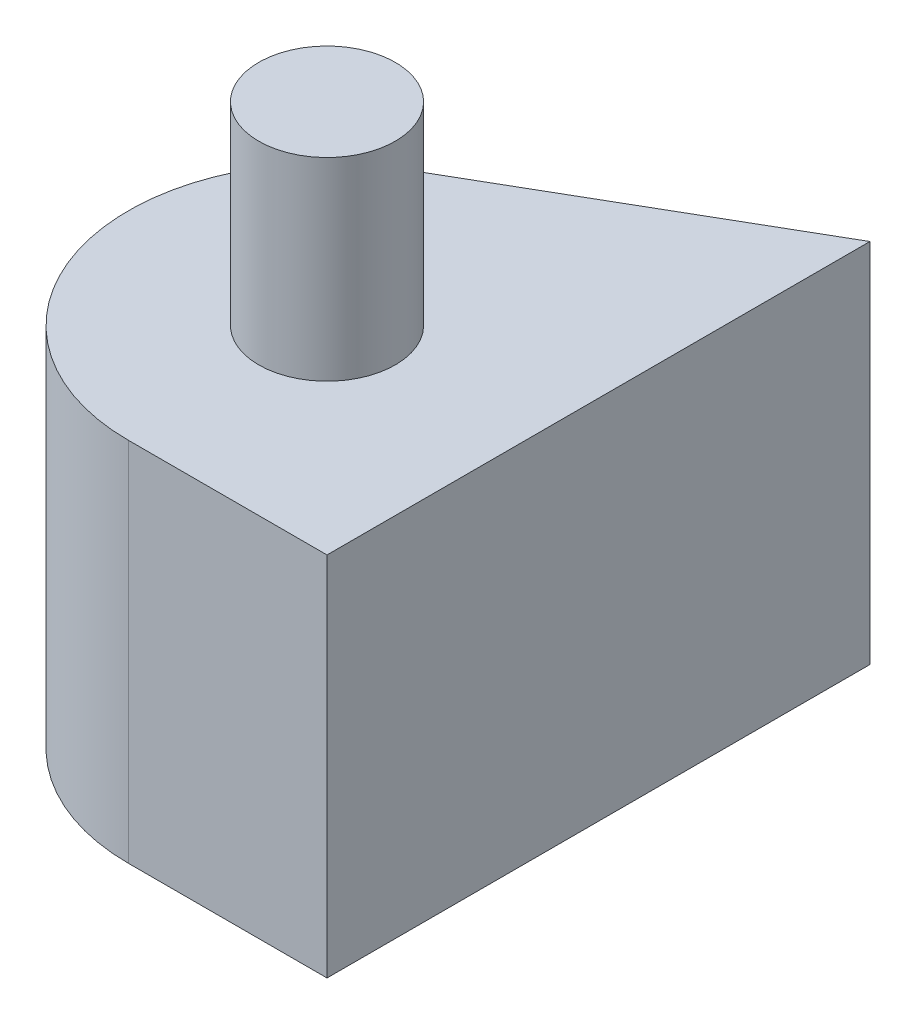
ISO-10303-21;
HEADER;
FILE_DESCRIPTION(('STEP AP214'),'2;1');
FILE_NAME('part.step','',(''),(''),'','','');
FILE_SCHEMA(('AUTOMOTIVE_DESIGN { 1 0 10303 214 1 1 1 1 }'));
ENDSEC;
DATA;
#1=APPLICATION_CONTEXT('core data for automotive mechanical design processes');
#2=APPLICATION_PROTOCOL_DEFINITION('international standard','automotive_design',2000,#1);
#3=PRODUCT_CONTEXT('',#1,'mechanical');
#4=PRODUCT('Part','Part','',(#3));
#5=PRODUCT_RELATED_PRODUCT_CATEGORY('part','',(#4));
#6=PRODUCT_DEFINITION_FORMATION('','',#4);
#7=PRODUCT_DEFINITION_CONTEXT('part definition',#1,'design');
#8=PRODUCT_DEFINITION('design','',#6,#7);
#9=PRODUCT_DEFINITION_SHAPE('','',#8);
#10=(LENGTH_UNIT() NAMED_UNIT(*) SI_UNIT(.MILLI.,.METRE.));
#11=(NAMED_UNIT(*) PLANE_ANGLE_UNIT() SI_UNIT($,.RADIAN.));
#12=(NAMED_UNIT(*) SI_UNIT($,.STERADIAN.) SOLID_ANGLE_UNIT());
#13=UNCERTAINTY_MEASURE_WITH_UNIT(LENGTH_MEASURE(1.E-05),#10,'distance_accuracy_value','');
#14=(GEOMETRIC_REPRESENTATION_CONTEXT(3) GLOBAL_UNCERTAINTY_ASSIGNED_CONTEXT((#13)) GLOBAL_UNIT_ASSIGNED_CONTEXT((#10,
#11,#12)) REPRESENTATION_CONTEXT('',''));
#15=CARTESIAN_POINT('',(0.,0.,0.));
#16=DIRECTION('',(0.,0.,1.));
#17=DIRECTION('',(1.,0.,0.));
#18=AXIS2_PLACEMENT_3D('',#15,#16,#17);
#19=CARTESIAN_POINT('',(0.,14.75,0.));
#20=DIRECTION('',(0.,-1.,0.));
#21=DIRECTION('',(0.,0.,-1.));
#22=AXIS2_PLACEMENT_3D('',#19,#20,#21);
#23=CYLINDRICAL_SURFACE('',#22,8.);
#24=CARTESIAN_POINT('',(0.,0.,0.));
#25=DIRECTION('',(0.,1.,0.));
#26=DIRECTION('',(0.,0.,1.));
#27=AXIS2_PLACEMENT_3D('',#24,#25,#26);
#28=CIRCLE('',#27,8.);
#29=CARTESIAN_POINT('',(-4.00000000000003,0.,-6.92820323027549));
#30=VERTEX_POINT('',#29);
#31=CARTESIAN_POINT('',(0.,0.,8.));
#32=VERTEX_POINT('',#31);
#33=EDGE_CURVE('E118',#30,#32,#28,.T.);
#34=ORIENTED_EDGE('',*,*,#33,.T.);
#35=DIRECTION('',(0.,-1.,0.));
#36=VECTOR('',#35,1.);
#37=CARTESIAN_POINT('',(0.,14.75,8.));
#38=LINE('',#37,#36);
#39=CARTESIAN_POINT('',(0.,14.75,8.));
#40=VERTEX_POINT('',#39);
#41=EDGE_CURVE('E55',#40,#32,#38,.T.);
#42=ORIENTED_EDGE('',*,*,#41,.F.);
#43=CARTESIAN_POINT('',(0.,14.75,0.));
#44=DIRECTION('',(0.,1.,0.));
#45=DIRECTION('',(0.,0.,1.));
#46=AXIS2_PLACEMENT_3D('',#43,#44,#45);
#47=CIRCLE('',#46,8.);
#48=CARTESIAN_POINT('',(-4.00000000000003,14.75,-6.92820323027549));
#49=VERTEX_POINT('',#48);
#50=EDGE_CURVE('E100',#49,#40,#47,.T.);
#51=ORIENTED_EDGE('',*,*,#50,.F.);
#52=DIRECTION('',(0.,-1.,0.));
#53=VECTOR('',#52,1.);
#54=CARTESIAN_POINT('',(-4.00000000000003,14.75,-6.92820323027549));
#55=LINE('',#54,#53);
#56=EDGE_CURVE('E114',#49,#30,#55,.T.);
#57=ORIENTED_EDGE('',*,*,#56,.T.);
#58=EDGE_LOOP('',(#34,#42,#51,#57));
#59=FACE_BOUND('',#58,.T.);
#60=ADVANCED_FACE('F45',(#59),#23,.T.);
#61=CARTESIAN_POINT('',(0.,14.75,8.));
#62=DIRECTION('',(0.,0.,-1.));
#63=DIRECTION('',(-1.,0.,0.));
#64=AXIS2_PLACEMENT_3D('',#61,#62,#63);
#65=PLANE('',#64);
#66=DIRECTION('',(1.,0.,0.));
#67=VECTOR('',#66,1.);
#68=CARTESIAN_POINT('',(0.,0.,8.));
#69=LINE('',#68,#67);
#70=CARTESIAN_POINT('',(8.,0.,8.));
#71=VERTEX_POINT('',#70);
#72=EDGE_CURVE('E106',#32,#71,#69,.T.);
#73=ORIENTED_EDGE('',*,*,#72,.T.);
#74=DIRECTION('',(0.,-1.,0.));
#75=VECTOR('',#74,1.);
#76=CARTESIAN_POINT('',(8.,14.75,8.));
#77=LINE('',#76,#75);
#78=CARTESIAN_POINT('',(8.,14.75,8.));
#79=VERTEX_POINT('',#78);
#80=EDGE_CURVE('E104',#79,#71,#77,.T.);
#81=ORIENTED_EDGE('',*,*,#80,.F.);
#82=DIRECTION('',(1.,0.,0.));
#83=VECTOR('',#82,1.);
#84=CARTESIAN_POINT('',(0.,14.75,8.));
#85=LINE('',#84,#83);
#86=EDGE_CURVE('E95',#40,#79,#85,.T.);
#87=ORIENTED_EDGE('',*,*,#86,.F.);
#88=ORIENTED_EDGE('',*,*,#41,.T.);
#89=EDGE_LOOP('',(#73,#81,#87,#88));
#90=FACE_BOUND('',#89,.T.);
#91=ADVANCED_FACE('F105',(#90),#65,.F.);
#92=CARTESIAN_POINT('',(8.,14.75,8.));
#93=DIRECTION('',(-1.,0.,0.));
#94=DIRECTION('',(0.,0.,1.));
#95=AXIS2_PLACEMENT_3D('',#92,#93,#94);
#96=PLANE('',#95);
#97=DIRECTION('',(0.,0.,-1.));
#98=VECTOR('',#97,1.);
#99=CARTESIAN_POINT('',(8.,0.,8.));
#100=LINE('',#99,#98);
#101=CARTESIAN_POINT('',(8.,0.,-13.8564064605511));
#102=VERTEX_POINT('',#101);
#103=EDGE_CURVE('E81',#71,#102,#100,.T.);
#104=ORIENTED_EDGE('',*,*,#103,.T.);
#105=DIRECTION('',(0.,-1.,0.));
#106=VECTOR('',#105,1.);
#107=CARTESIAN_POINT('',(8.,14.75,-13.8564064605511));
#108=LINE('',#107,#106);
#109=CARTESIAN_POINT('',(8.,14.75,-13.8564064605511));
#110=VERTEX_POINT('',#109);
#111=EDGE_CURVE('E108',#110,#102,#108,.T.);
#112=ORIENTED_EDGE('',*,*,#111,.F.);
#113=DIRECTION('',(0.,0.,-1.));
#114=VECTOR('',#113,1.);
#115=CARTESIAN_POINT('',(8.,14.75,8.));
#116=LINE('',#115,#114);
#117=EDGE_CURVE('E98',#79,#110,#116,.T.);
#118=ORIENTED_EDGE('',*,*,#117,.F.);
#119=ORIENTED_EDGE('',*,*,#80,.T.);
#120=EDGE_LOOP('',(#104,#112,#118,#119));
#121=FACE_BOUND('',#120,.T.);
#122=ADVANCED_FACE('F110',(#121),#96,.F.);
#123=CARTESIAN_POINT('',(8.,14.75,-13.8564064605511));
#124=DIRECTION('',(0.500000000000004,0.,0.866025403784436));
#125=DIRECTION('',(0.866025403784436,0.,-0.500000000000004));
#126=AXIS2_PLACEMENT_3D('',#123,#124,#125);
#127=PLANE('',#126);
#128=DIRECTION('',(-0.866025403784436,0.,0.500000000000004));
#129=VECTOR('',#128,1.);
#130=CARTESIAN_POINT('',(8.,0.,-13.8564064605511));
#131=LINE('',#130,#129);
#132=EDGE_CURVE('E87',#102,#30,#131,.T.);
#133=ORIENTED_EDGE('',*,*,#132,.T.);
#134=ORIENTED_EDGE('',*,*,#56,.F.);
#135=DIRECTION('',(-0.866025403784436,0.,0.500000000000004));
#136=VECTOR('',#135,1.);
#137=CARTESIAN_POINT('',(8.,14.75,-13.8564064605511));
#138=LINE('',#137,#136);
#139=EDGE_CURVE('E64',#110,#49,#138,.T.);
#140=ORIENTED_EDGE('',*,*,#139,.F.);
#141=ORIENTED_EDGE('',*,*,#111,.T.);
#142=EDGE_LOOP('',(#133,#134,#140,#141));
#143=FACE_BOUND('',#142,.T.);
#144=ADVANCED_FACE('F148',(#143),#127,.F.);
#145=CARTESIAN_POINT('',(0.,14.75,0.));
#146=DIRECTION('',(0.,1.,0.));
#147=DIRECTION('',(0.,0.,1.));
#148=AXIS2_PLACEMENT_3D('',#145,#146,#147);
#149=PLANE('',#148);
#150=CARTESIAN_POINT('',(0.,14.75,0.));
#151=DIRECTION('',(0.,1.,0.));
#152=DIRECTION('',(0.,0.,1.));
#153=AXIS2_PLACEMENT_3D('',#150,#151,#152);
#154=CIRCLE('',#153,2.75);
#155=CARTESIAN_POINT('',(0.,14.75,2.75));
#156=VERTEX_POINT('',#155);
#157=EDGE_CURVE('E11',#156,#156,#154,.T.);
#158=ORIENTED_EDGE('',*,*,#157,.F.);
#159=EDGE_LOOP('',(#158));
#160=FACE_BOUND('',#159,.T.);
#161=ORIENTED_EDGE('',*,*,#50,.T.);
#162=ORIENTED_EDGE('',*,*,#86,.T.);
#163=ORIENTED_EDGE('',*,*,#117,.T.);
#164=ORIENTED_EDGE('',*,*,#139,.T.);
#165=EDGE_LOOP('',(#161,#162,#163,#164));
#166=FACE_BOUND('',#165,.T.);
#167=ADVANCED_FACE('F96',(#160,#166),#149,.T.);
#168=CARTESIAN_POINT('',(0.,0.,0.));
#169=DIRECTION('',(0.,1.,0.));
#170=DIRECTION('',(0.,0.,1.));
#171=AXIS2_PLACEMENT_3D('',#168,#169,#170);
#172=PLANE('',#171);
#173=CARTESIAN_POINT('',(0.,0.,0.));
#174=DIRECTION('',(0.,1.,0.));
#175=DIRECTION('',(0.,0.,1.));
#176=AXIS2_PLACEMENT_3D('',#173,#174,#175);
#177=CIRCLE('',#176,2.75);
#178=CARTESIAN_POINT('',(0.,0.,2.75));
#179=VERTEX_POINT('',#178);
#180=EDGE_CURVE('E48',#179,#179,#177,.T.);
#181=ORIENTED_EDGE('',*,*,#180,.T.);
#182=EDGE_LOOP('',(#181));
#183=FACE_BOUND('',#182,.T.);
#184=ORIENTED_EDGE('',*,*,#33,.F.);
#185=ORIENTED_EDGE('',*,*,#132,.F.);
#186=ORIENTED_EDGE('',*,*,#103,.F.);
#187=ORIENTED_EDGE('',*,*,#72,.F.);
#188=EDGE_LOOP('',(#184,#185,#186,#187));
#189=FACE_BOUND('',#188,.T.);
#190=ADVANCED_FACE('F136',(#183,#189),#172,.F.);
#191=CARTESIAN_POINT('',(0.,22.55,0.));
#192=DIRECTION('',(0.,-1.,0.));
#193=DIRECTION('',(0.,0.,-1.));
#194=AXIS2_PLACEMENT_3D('',#191,#192,#193);
#195=CYLINDRICAL_SURFACE('',#194,2.75);
#196=CARTESIAN_POINT('',(0.,22.55,0.));
#197=DIRECTION('',(0.,1.,0.));
#198=DIRECTION('',(0.,0.,1.));
#199=AXIS2_PLACEMENT_3D('',#196,#197,#198);
#200=CIRCLE('',#199,2.75);
#201=CARTESIAN_POINT('',(0.,22.55,2.75));
#202=VERTEX_POINT('',#201);
#203=EDGE_CURVE('E122',#202,#202,#200,.T.);
#204=ORIENTED_EDGE('',*,*,#203,.F.);
#205=EDGE_LOOP('',(#204));
#206=FACE_BOUND('',#205,.T.);
#207=ORIENTED_EDGE('',*,*,#157,.T.);
#208=EDGE_LOOP('',(#207));
#209=FACE_BOUND('',#208,.T.);
#210=ADVANCED_FACE('F138',(#206,#209),#195,.T.);
#211=CARTESIAN_POINT('',(0.,22.55,0.));
#212=DIRECTION('',(0.,1.,0.));
#213=DIRECTION('',(0.,0.,1.));
#214=AXIS2_PLACEMENT_3D('',#211,#212,#213);
#215=PLANE('',#214);
#216=ORIENTED_EDGE('',*,*,#203,.T.);
#217=EDGE_LOOP('',(#216));
#218=FACE_BOUND('',#217,.T.);
#219=ADVANCED_FACE('F145',(#218),#215,.T.);
#220=CARTESIAN_POINT('',(0.,-3.15,0.));
#221=DIRECTION('',(0.,1.,0.));
#222=DIRECTION('',(0.,0.,1.));
#223=AXIS2_PLACEMENT_3D('',#220,#221,#222);
#224=CYLINDRICAL_SURFACE('',#223,2.75);
#225=CARTESIAN_POINT('',(0.,-3.15,0.));
#226=DIRECTION('',(0.,1.,0.));
#227=DIRECTION('',(0.,0.,1.));
#228=AXIS2_PLACEMENT_3D('',#225,#226,#227);
#229=CIRCLE('',#228,2.75);
#230=CARTESIAN_POINT('',(0.,-3.15,2.75));
#231=VERTEX_POINT('',#230);
#232=EDGE_CURVE('E249',#231,#231,#229,.T.);
#233=CARTESIAN_POINT('',(0.,-3.15,2.75));
#234=CARTESIAN_POINT('',(0.,-3.1171875,2.75));
#235=CARTESIAN_POINT('',(0.,-3.084375,2.75));
#236=CARTESIAN_POINT('',(0.,-3.01875,2.75));
#237=CARTESIAN_POINT('',(0.,-2.9859375,2.75));
#238=CARTESIAN_POINT('',(0.,-2.9203125,2.75));
#239=CARTESIAN_POINT('',(0.,-2.8875,2.75));
#240=CARTESIAN_POINT('',(0.,-2.821875,2.75));
#241=CARTESIAN_POINT('',(0.,-2.7890625,2.75));
#242=CARTESIAN_POINT('',(0.,-2.7234375,2.75));
#243=CARTESIAN_POINT('',(0.,-2.690625,2.75));
#244=CARTESIAN_POINT('',(0.,-2.625,2.75));
#245=CARTESIAN_POINT('',(0.,-2.5921875,2.75));
#246=CARTESIAN_POINT('',(0.,-2.5265625,2.75));
#247=CARTESIAN_POINT('',(0.,-2.49375,2.75));
#248=CARTESIAN_POINT('',(0.,-2.428125,2.75));
#249=CARTESIAN_POINT('',(0.,-2.3953125,2.75));
#250=CARTESIAN_POINT('',(0.,-2.3296875,2.75));
#251=CARTESIAN_POINT('',(0.,-2.296875,2.75));
#252=CARTESIAN_POINT('',(0.,-2.23125,2.75));
#253=CARTESIAN_POINT('',(0.,-2.1984375,2.75));
#254=CARTESIAN_POINT('',(0.,-2.1328125,2.75));
#255=CARTESIAN_POINT('',(0.,-2.1,2.75));
#256=CARTESIAN_POINT('',(0.,-2.034375,2.75));
#257=CARTESIAN_POINT('',(0.,-2.0015625,2.75));
#258=CARTESIAN_POINT('',(0.,-1.9359375,2.75));
#259=CARTESIAN_POINT('',(0.,-1.903125,2.75));
#260=CARTESIAN_POINT('',(0.,-1.8375,2.75));
#261=CARTESIAN_POINT('',(0.,-1.8046875,2.75));
#262=CARTESIAN_POINT('',(0.,-1.7390625,2.75));
#263=CARTESIAN_POINT('',(0.,-1.70625,2.75));
#264=CARTESIAN_POINT('',(0.,-1.640625,2.75));
#265=CARTESIAN_POINT('',(0.,-1.6078125,2.75));
#266=CARTESIAN_POINT('',(0.,-1.5421875,2.75));
#267=CARTESIAN_POINT('',(0.,-1.509375,2.75));
#268=CARTESIAN_POINT('',(0.,-1.44375,2.75));
#269=CARTESIAN_POINT('',(0.,-1.4109375,2.75));
#270=CARTESIAN_POINT('',(0.,-1.3453125,2.75));
#271=CARTESIAN_POINT('',(0.,-1.3125,2.75));
#272=CARTESIAN_POINT('',(0.,-1.246875,2.75));
#273=CARTESIAN_POINT('',(0.,-1.2140625,2.75));
#274=CARTESIAN_POINT('',(0.,-1.1484375,2.75));
#275=CARTESIAN_POINT('',(0.,-1.115625,2.75));
#276=CARTESIAN_POINT('',(0.,-1.05,2.75));
#277=CARTESIAN_POINT('',(0.,-1.0171875,2.75));
#278=CARTESIAN_POINT('',(0.,-0.9515625,2.75));
#279=CARTESIAN_POINT('',(0.,-0.91875,2.75));
#280=CARTESIAN_POINT('',(0.,-0.853125,2.75));
#281=CARTESIAN_POINT('',(0.,-0.8203125,2.75));
#282=CARTESIAN_POINT('',(0.,-0.754687500000001,2.75));
#283=CARTESIAN_POINT('',(0.,-0.721875,2.75));
#284=CARTESIAN_POINT('',(0.,-0.65625,2.75));
#285=CARTESIAN_POINT('',(0.,-0.6234375,2.75));
#286=CARTESIAN_POINT('',(0.,-0.5578125,2.75));
#287=CARTESIAN_POINT('',(0.,-0.525,2.75));
#288=CARTESIAN_POINT('',(0.,-0.459375,2.75));
#289=CARTESIAN_POINT('',(0.,-0.4265625,2.75));
#290=CARTESIAN_POINT('',(0.,-0.3609375,2.75));
#291=CARTESIAN_POINT('',(0.,-0.328125,2.75));
#292=CARTESIAN_POINT('',(0.,-0.2625,2.75));
#293=CARTESIAN_POINT('',(0.,-0.2296875,2.75));
#294=CARTESIAN_POINT('',(0.,-0.1640625,2.75));
#295=CARTESIAN_POINT('',(0.,-0.13125,2.75));
#296=CARTESIAN_POINT('',(0.,-0.0656250000000004,2.75));
#297=CARTESIAN_POINT('',(0.,-0.0328125000000004,2.75));
#298=CARTESIAN_POINT('',(0.,0.,2.75));
#299=B_SPLINE_CURVE_WITH_KNOTS('',3,(#233,#234,#235,#236,#237,#238,#239,#240,#241,#242,#243,
#244,#245,#246,#247,#248,#249,#250,#251,#252,#253,#254,#255,#256,#257,#258,#259,#260,#261,#262,
#263,#264,#265,#266,#267,#268,#269,#270,#271,#272,#273,#274,#275,#276,#277,#278,#279,#280,#281,
#282,#283,#284,#285,#286,#287,#288,#289,#290,#291,#292,#293,#294,#295,#296,#297,#298),
.UNSPECIFIED.,.F.,.F.,(4,2,2,2,2,2,2,2,2,2,2,2,2,2,2,2,2,2,2,2,2,2,2,2,2,2,2,2,2,2,2,2,4),(0.,
0.0984375,0.196875,0.2953125,0.39375,0.4921875,0.590625,0.6890625,0.7875,0.8859375,0.984375,
1.0828125,1.18125,1.2796875,1.378125,1.4765625,1.575,1.6734375,1.771875,1.8703125,1.96875,
2.0671875,2.165625,2.2640625,2.3625,2.4609375,2.559375,2.6578125,2.75625,2.8546875,2.953125,
3.0515625,3.15),.UNSPECIFIED.);
#300=EDGE_CURVE('BSEAM187',#231,#179,#299,.T.);
#301=ORIENTED_EDGE('',*,*,#232,.T.);
#302=ORIENTED_EDGE('',*,*,#180,.F.);
#303=ORIENTED_EDGE('',*,*,#300,.T.);
#304=ORIENTED_EDGE('',*,*,#300,.F.);
#305=EDGE_LOOP('',(#301,#303,#302,#304));
#306=FACE_BOUND('',#305,.T.);
#307=ADVANCED_FACE('F187',(#306),#224,.T.);
#308=CARTESIAN_POINT('',(0.,-3.15,0.));
#309=DIRECTION('',(0.,1.,0.));
#310=DIRECTION('',(0.,0.,1.));
#311=AXIS2_PLACEMENT_3D('',#308,#309,#310);
#312=PLANE('',#311);
#313=ORIENTED_EDGE('',*,*,#232,.F.);
#314=EDGE_LOOP('',(#313));
#315=FACE_BOUND('',#314,.T.);
#316=ADVANCED_FACE('F203',(#315),#312,.F.);
#317=CLOSED_SHELL('',(#60,#91,#122,#144,#167,#190,#210,#219,#307,#316));
#318=MANIFOLD_SOLID_BREP('B2',#317);
#319=ADVANCED_BREP_SHAPE_REPRESENTATION('',(#18,#318),#14);
#320=SHAPE_DEFINITION_REPRESENTATION(#9,#319);
ENDSEC;
END-ISO-10303-21;
